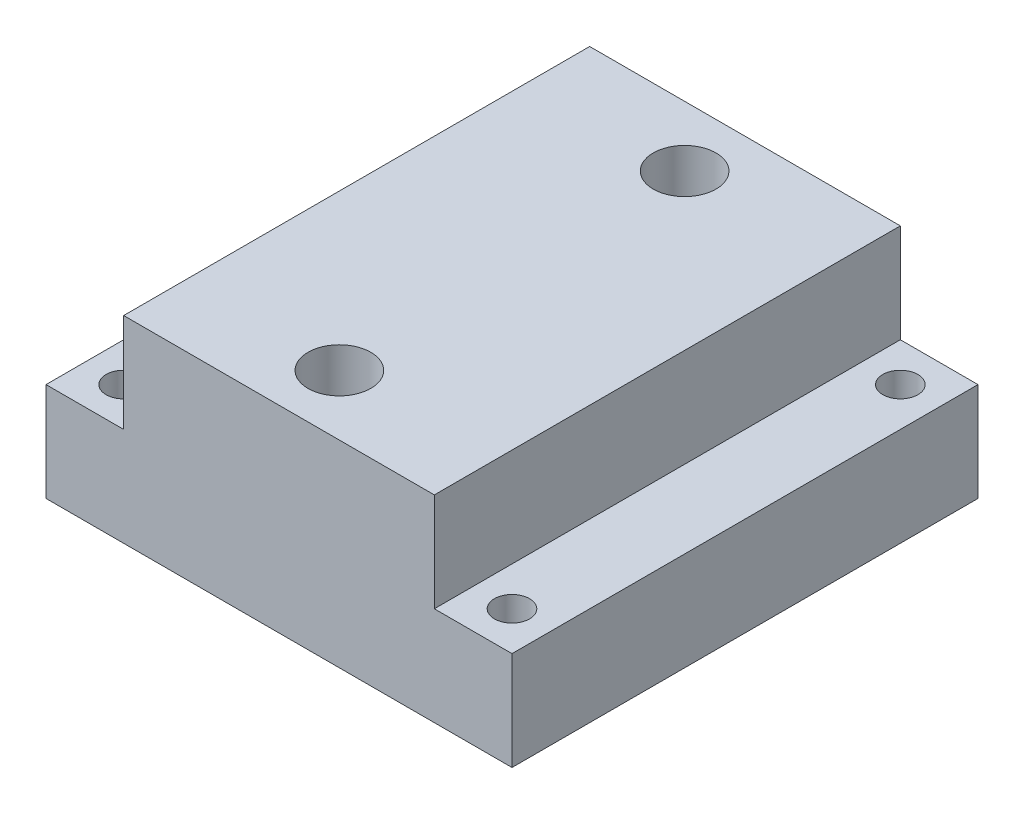
ISO-10303-21;
HEADER;
FILE_DESCRIPTION(('STEP AP214'),'2;1');
FILE_NAME('part.step','',(''),(''),'','','');
FILE_SCHEMA(('AUTOMOTIVE_DESIGN { 1 0 10303 214 1 1 1 1 }'));
ENDSEC;
DATA;
#1=APPLICATION_CONTEXT('core data for automotive mechanical design processes');
#2=APPLICATION_PROTOCOL_DEFINITION('international standard','automotive_design',2000,#1);
#3=PRODUCT_CONTEXT('',#1,'mechanical');
#4=PRODUCT('Part','Part','',(#3));
#5=PRODUCT_RELATED_PRODUCT_CATEGORY('part','',(#4));
#6=PRODUCT_DEFINITION_FORMATION('','',#4);
#7=PRODUCT_DEFINITION_CONTEXT('part definition',#1,'design');
#8=PRODUCT_DEFINITION('design','',#6,#7);
#9=PRODUCT_DEFINITION_SHAPE('','',#8);
#10=(LENGTH_UNIT() NAMED_UNIT(*) SI_UNIT(.MILLI.,.METRE.));
#11=(NAMED_UNIT(*) PLANE_ANGLE_UNIT() SI_UNIT($,.RADIAN.));
#12=(NAMED_UNIT(*) SI_UNIT($,.STERADIAN.) SOLID_ANGLE_UNIT());
#13=UNCERTAINTY_MEASURE_WITH_UNIT(LENGTH_MEASURE(1.E-05),#10,'distance_accuracy_value','');
#14=(GEOMETRIC_REPRESENTATION_CONTEXT(3) GLOBAL_UNCERTAINTY_ASSIGNED_CONTEXT((#13)) GLOBAL_UNIT_ASSIGNED_CONTEXT((#10,
#11,#12)) REPRESENTATION_CONTEXT('',''));
#15=CARTESIAN_POINT('',(0.,0.,0.));
#16=DIRECTION('',(0.,0.,1.));
#17=DIRECTION('',(1.,0.,0.));
#18=AXIS2_PLACEMENT_3D('',#15,#16,#17);
#19=CARTESIAN_POINT('',(0.,0.,30.));
#20=DIRECTION('',(1.,0.,0.));
#21=DIRECTION('',(0.,0.,-1.));
#22=AXIS2_PLACEMENT_3D('',#19,#20,#21);
#23=PLANE('',#22);
#24=DIRECTION('',(0.,0.,1.));
#25=VECTOR('',#24,1.);
#26=CARTESIAN_POINT('',(0.,6.35,30.));
#27=LINE('',#26,#25);
#28=CARTESIAN_POINT('',(0.,6.35,0.));
#29=VERTEX_POINT('',#28);
#30=CARTESIAN_POINT('',(0.,6.35,30.));
#31=VERTEX_POINT('',#30);
#32=EDGE_CURVE('E211',#29,#31,#27,.T.);
#33=ORIENTED_EDGE('',*,*,#32,.F.);
#34=DIRECTION('',(0.,-1.,0.));
#35=VECTOR('',#34,1.);
#36=CARTESIAN_POINT('',(0.,0.,0.));
#37=LINE('',#36,#35);
#38=CARTESIAN_POINT('',(0.,0.,0.));
#39=VERTEX_POINT('',#38);
#40=EDGE_CURVE('E172',#29,#39,#37,.T.);
#41=ORIENTED_EDGE('',*,*,#40,.T.);
#42=DIRECTION('',(0.,0.,-1.));
#43=VECTOR('',#42,1.);
#44=CARTESIAN_POINT('',(0.,0.,30.));
#45=LINE('',#44,#43);
#46=CARTESIAN_POINT('',(0.,0.,30.));
#47=VERTEX_POINT('',#46);
#48=EDGE_CURVE('E13',#47,#39,#45,.T.);
#49=ORIENTED_EDGE('',*,*,#48,.F.);
#50=DIRECTION('',(0.,-1.,0.));
#51=VECTOR('',#50,1.);
#52=CARTESIAN_POINT('',(0.,0.,30.));
#53=LINE('',#52,#51);
#54=EDGE_CURVE('E185',#31,#47,#53,.T.);
#55=ORIENTED_EDGE('',*,*,#54,.F.);
#56=EDGE_LOOP('',(#33,#41,#49,#55));
#57=FACE_BOUND('',#56,.T.);
#58=ADVANCED_FACE('F49',(#57),#23,.F.);
#59=CARTESIAN_POINT('',(30.,0.,30.));
#60=DIRECTION('',(-1.,0.,0.));
#61=DIRECTION('',(0.,0.,1.));
#62=AXIS2_PLACEMENT_3D('',#59,#60,#61);
#63=PLANE('',#62);
#64=DIRECTION('',(0.,0.,-1.));
#65=VECTOR('',#64,1.);
#66=CARTESIAN_POINT('',(30.,6.35,30.));
#67=LINE('',#66,#65);
#68=CARTESIAN_POINT('',(30.,6.35,30.));
#69=VERTEX_POINT('',#68);
#70=CARTESIAN_POINT('',(30.,6.35,0.));
#71=VERTEX_POINT('',#70);
#72=EDGE_CURVE('E77',#69,#71,#67,.T.);
#73=ORIENTED_EDGE('',*,*,#72,.F.);
#74=DIRECTION('',(0.,1.,0.));
#75=VECTOR('',#74,1.);
#76=CARTESIAN_POINT('',(30.,0.,30.));
#77=LINE('',#76,#75);
#78=CARTESIAN_POINT('',(30.,0.,30.));
#79=VERTEX_POINT('',#78);
#80=EDGE_CURVE('E160',#79,#69,#77,.T.);
#81=ORIENTED_EDGE('',*,*,#80,.F.);
#82=DIRECTION('',(0.,0.,-1.));
#83=VECTOR('',#82,1.);
#84=CARTESIAN_POINT('',(30.,0.,30.));
#85=LINE('',#84,#83);
#86=CARTESIAN_POINT('',(30.,0.,0.));
#87=VERTEX_POINT('',#86);
#88=EDGE_CURVE('E58',#79,#87,#85,.T.);
#89=ORIENTED_EDGE('',*,*,#88,.T.);
#90=DIRECTION('',(0.,1.,0.));
#91=VECTOR('',#90,1.);
#92=CARTESIAN_POINT('',(30.,0.,0.));
#93=LINE('',#92,#91);
#94=EDGE_CURVE('E179',#87,#71,#93,.T.);
#95=ORIENTED_EDGE('',*,*,#94,.T.);
#96=EDGE_LOOP('',(#73,#81,#89,#95));
#97=FACE_BOUND('',#96,.T.);
#98=ADVANCED_FACE('F265',(#97),#63,.F.);
#99=CARTESIAN_POINT('',(0.,12.7,30.));
#100=DIRECTION('',(0.,-1.,0.));
#101=DIRECTION('',(0.,0.,-1.));
#102=AXIS2_PLACEMENT_3D('',#99,#100,#101);
#103=PLANE('',#102);
#104=CARTESIAN_POINT('',(15.,12.7,3.8875));
#105=DIRECTION('',(0.,1.,0.));
#106=DIRECTION('',(0.,0.,1.));
#107=AXIS2_PLACEMENT_3D('',#104,#105,#106);
#108=CIRCLE('',#107,2.01929999999999);
#109=CARTESIAN_POINT('',(15.,12.7,5.90679999999999));
#110=VERTEX_POINT('',#109);
#111=EDGE_CURVE('E256',#110,#110,#108,.T.);
#112=ORIENTED_EDGE('',*,*,#111,.F.);
#113=EDGE_LOOP('',(#112));
#114=FACE_BOUND('',#113,.T.);
#115=CARTESIAN_POINT('',(15.,12.7,26.1125));
#116=DIRECTION('',(0.,1.,0.));
#117=DIRECTION('',(0.,0.,1.));
#118=AXIS2_PLACEMENT_3D('',#115,#116,#117);
#119=CIRCLE('',#118,2.01929999999999);
#120=CARTESIAN_POINT('',(15.,12.7,28.1318));
#121=VERTEX_POINT('',#120);
#122=EDGE_CURVE('E249',#121,#121,#119,.T.);
#123=ORIENTED_EDGE('',*,*,#122,.F.);
#124=EDGE_LOOP('',(#123));
#125=FACE_BOUND('',#124,.T.);
#126=DIRECTION('',(0.,0.,-1.));
#127=VECTOR('',#126,1.);
#128=CARTESIAN_POINT('',(25.,12.7,0.));
#129=LINE('',#128,#127);
#130=CARTESIAN_POINT('',(25.,12.7,30.));
#131=VERTEX_POINT('',#130);
#132=CARTESIAN_POINT('',(25.,12.7,0.));
#133=VERTEX_POINT('',#132);
#134=EDGE_CURVE('E131',#131,#133,#129,.T.);
#135=ORIENTED_EDGE('',*,*,#134,.T.);
#136=DIRECTION('',(-1.,0.,0.));
#137=VECTOR('',#136,1.);
#138=CARTESIAN_POINT('',(0.,12.7,0.));
#139=LINE('',#138,#137);
#140=CARTESIAN_POINT('',(5.,12.7,0.));
#141=VERTEX_POINT('',#140);
#142=EDGE_CURVE('E183',#133,#141,#139,.T.);
#143=ORIENTED_EDGE('',*,*,#142,.T.);
#144=DIRECTION('',(0.,0.,1.));
#145=VECTOR('',#144,1.);
#146=CARTESIAN_POINT('',(5.,12.7,0.));
#147=LINE('',#146,#145);
#148=CARTESIAN_POINT('',(4.99999999999999,12.7,30.));
#149=VERTEX_POINT('',#148);
#150=EDGE_CURVE('E145',#141,#149,#147,.T.);
#151=ORIENTED_EDGE('',*,*,#150,.T.);
#152=DIRECTION('',(-1.,0.,0.));
#153=VECTOR('',#152,1.);
#154=CARTESIAN_POINT('',(0.,12.7,30.));
#155=LINE('',#154,#153);
#156=EDGE_CURVE('E152',#131,#149,#155,.T.);
#157=ORIENTED_EDGE('',*,*,#156,.F.);
#158=EDGE_LOOP('',(#135,#143,#151,#157));
#159=FACE_BOUND('',#158,.T.);
#160=ADVANCED_FACE('F158',(#114,#125,#159),#103,.F.);
#161=CARTESIAN_POINT('',(0.,0.,30.));
#162=DIRECTION('',(0.,0.,-1.));
#163=DIRECTION('',(-1.,0.,0.));
#164=AXIS2_PLACEMENT_3D('',#161,#162,#163);
#165=PLANE('',#164);
#166=DIRECTION('',(1.,0.,0.));
#167=VECTOR('',#166,1.);
#168=CARTESIAN_POINT('',(0.,6.35,30.));
#169=LINE('',#168,#167);
#170=CARTESIAN_POINT('',(4.99999999999999,6.35,30.));
#171=VERTEX_POINT('',#170);
#172=EDGE_CURVE('E210',#31,#171,#169,.T.);
#173=ORIENTED_EDGE('',*,*,#172,.F.);
#174=ORIENTED_EDGE('',*,*,#54,.T.);
#175=DIRECTION('',(1.,0.,0.));
#176=VECTOR('',#175,1.);
#177=CARTESIAN_POINT('',(0.,0.,30.));
#178=LINE('',#177,#176);
#179=EDGE_CURVE('E168',#47,#79,#178,.T.);
#180=ORIENTED_EDGE('',*,*,#179,.T.);
#181=ORIENTED_EDGE('',*,*,#80,.T.);
#182=CARTESIAN_POINT('',(25.,6.35,30.));
#183=VERTEX_POINT('',#182);
#184=EDGE_CURVE('E154',#183,#69,#169,.T.);
#185=ORIENTED_EDGE('',*,*,#184,.F.);
#186=DIRECTION('',(0.,1.,0.));
#187=VECTOR('',#186,1.);
#188=CARTESIAN_POINT('',(25.,-44.3465934268522,30.));
#189=LINE('',#188,#187);
#190=EDGE_CURVE('E135',#183,#131,#189,.T.);
#191=ORIENTED_EDGE('',*,*,#190,.T.);
#192=ORIENTED_EDGE('',*,*,#156,.T.);
#193=DIRECTION('',(0.,1.,0.));
#194=VECTOR('',#193,1.);
#195=CARTESIAN_POINT('',(4.99999999999999,-44.3465934268522,30.));
#196=LINE('',#195,#194);
#197=EDGE_CURVE('E144',#171,#149,#196,.T.);
#198=ORIENTED_EDGE('',*,*,#197,.F.);
#199=EDGE_LOOP('',(#173,#174,#180,#181,#185,#191,#192,#198));
#200=FACE_BOUND('',#199,.T.);
#201=ADVANCED_FACE('F150',(#200),#165,.F.);
#202=CARTESIAN_POINT('',(0.,0.,0.));
#203=DIRECTION('',(0.,0.,-1.));
#204=DIRECTION('',(-1.,0.,0.));
#205=AXIS2_PLACEMENT_3D('',#202,#203,#204);
#206=PLANE('',#205);
#207=ORIENTED_EDGE('',*,*,#40,.F.);
#208=DIRECTION('',(1.,0.,0.));
#209=VECTOR('',#208,1.);
#210=CARTESIAN_POINT('',(0.,6.35,0.));
#211=LINE('',#210,#209);
#212=CARTESIAN_POINT('',(5.,6.35,0.));
#213=VERTEX_POINT('',#212);
#214=EDGE_CURVE('E213',#29,#213,#211,.T.);
#215=ORIENTED_EDGE('',*,*,#214,.T.);
#216=DIRECTION('',(0.,1.,0.));
#217=VECTOR('',#216,1.);
#218=CARTESIAN_POINT('',(5.,-44.3465934268522,0.));
#219=LINE('',#218,#217);
#220=EDGE_CURVE('E235',#213,#141,#219,.T.);
#221=ORIENTED_EDGE('',*,*,#220,.T.);
#222=ORIENTED_EDGE('',*,*,#142,.F.);
#223=DIRECTION('',(0.,1.,0.));
#224=VECTOR('',#223,1.);
#225=CARTESIAN_POINT('',(25.,-44.3465934268522,0.));
#226=LINE('',#225,#224);
#227=CARTESIAN_POINT('',(25.,6.35,0.));
#228=VERTEX_POINT('',#227);
#229=EDGE_CURVE('E138',#228,#133,#226,.T.);
#230=ORIENTED_EDGE('',*,*,#229,.F.);
#231=EDGE_CURVE('E218',#228,#71,#211,.T.);
#232=ORIENTED_EDGE('',*,*,#231,.T.);
#233=ORIENTED_EDGE('',*,*,#94,.F.);
#234=DIRECTION('',(1.,0.,0.));
#235=VECTOR('',#234,1.);
#236=CARTESIAN_POINT('',(0.,0.,0.));
#237=LINE('',#236,#235);
#238=EDGE_CURVE('E175',#39,#87,#237,.T.);
#239=ORIENTED_EDGE('',*,*,#238,.F.);
#240=EDGE_LOOP('',(#207,#215,#221,#222,#230,#232,#233,#239));
#241=FACE_BOUND('',#240,.T.);
#242=ADVANCED_FACE('F296',(#241),#206,.T.);
#243=CARTESIAN_POINT('',(2.5,12.7,27.5));
#244=DIRECTION('',(0.,1.,0.));
#245=DIRECTION('',(0.,0.,1.));
#246=AXIS2_PLACEMENT_3D('',#243,#244,#245);
#247=CYLINDRICAL_SURFACE('',#246,1.13029999999999);
#248=CARTESIAN_POINT('',(2.5,0.,27.5));
#249=DIRECTION('',(0.,1.,0.));
#250=DIRECTION('',(0.,0.,1.));
#251=AXIS2_PLACEMENT_3D('',#248,#249,#250);
#252=CIRCLE('',#251,1.1303);
#253=CARTESIAN_POINT('',(2.5,0.,28.6303));
#254=VERTEX_POINT('',#253);
#255=EDGE_CURVE('E176',#254,#254,#252,.T.);
#256=ORIENTED_EDGE('',*,*,#255,.F.);
#257=EDGE_LOOP('',(#256));
#258=FACE_BOUND('',#257,.T.);
#259=CARTESIAN_POINT('',(2.5,6.35,27.5));
#260=DIRECTION('',(0.,1.,0.));
#261=DIRECTION('',(0.,0.,1.));
#262=AXIS2_PLACEMENT_3D('',#259,#260,#261);
#263=CIRCLE('',#262,1.13029999999999);
#264=CARTESIAN_POINT('',(2.5,6.35,28.6303));
#265=VERTEX_POINT('',#264);
#266=EDGE_CURVE('E221',#265,#265,#263,.F.);
#267=ORIENTED_EDGE('',*,*,#266,.F.);
#268=EDGE_LOOP('',(#267));
#269=FACE_BOUND('',#268,.T.);
#270=ADVANCED_FACE('F319',(#258,#269),#247,.F.);
#271=CARTESIAN_POINT('',(27.5,12.7,27.5));
#272=DIRECTION('',(0.,1.,0.));
#273=DIRECTION('',(0.,0.,1.));
#274=AXIS2_PLACEMENT_3D('',#271,#272,#273);
#275=CYLINDRICAL_SURFACE('',#274,1.13029999999999);
#276=CARTESIAN_POINT('',(27.5,0.,27.5));
#277=DIRECTION('',(0.,1.,0.));
#278=DIRECTION('',(0.,0.,1.));
#279=AXIS2_PLACEMENT_3D('',#276,#277,#278);
#280=CIRCLE('',#279,1.1303);
#281=CARTESIAN_POINT('',(27.5,0.,28.6303));
#282=VERTEX_POINT('',#281);
#283=EDGE_CURVE('E198',#282,#282,#280,.T.);
#284=ORIENTED_EDGE('',*,*,#283,.F.);
#285=EDGE_LOOP('',(#284));
#286=FACE_BOUND('',#285,.T.);
#287=CARTESIAN_POINT('',(27.5,6.35,27.5));
#288=DIRECTION('',(0.,1.,0.));
#289=DIRECTION('',(0.,0.,1.));
#290=AXIS2_PLACEMENT_3D('',#287,#288,#289);
#291=CIRCLE('',#290,1.13029999999999);
#292=CARTESIAN_POINT('',(27.5,6.35,28.6303));
#293=VERTEX_POINT('',#292);
#294=EDGE_CURVE('E225',#293,#293,#291,.F.);
#295=ORIENTED_EDGE('',*,*,#294,.F.);
#296=EDGE_LOOP('',(#295));
#297=FACE_BOUND('',#296,.T.);
#298=ADVANCED_FACE('F324',(#286,#297),#275,.F.);
#299=CARTESIAN_POINT('',(27.5,12.7,2.5));
#300=DIRECTION('',(0.,1.,0.));
#301=DIRECTION('',(0.,0.,1.));
#302=AXIS2_PLACEMENT_3D('',#299,#300,#301);
#303=CYLINDRICAL_SURFACE('',#302,1.13029999999999);
#304=CARTESIAN_POINT('',(27.5,0.,2.5));
#305=DIRECTION('',(0.,1.,0.));
#306=DIRECTION('',(0.,0.,1.));
#307=AXIS2_PLACEMENT_3D('',#304,#305,#306);
#308=CIRCLE('',#307,1.1303);
#309=CARTESIAN_POINT('',(27.5,0.,3.63029999999999));
#310=VERTEX_POINT('',#309);
#311=EDGE_CURVE('E202',#310,#310,#308,.T.);
#312=ORIENTED_EDGE('',*,*,#311,.F.);
#313=EDGE_LOOP('',(#312));
#314=FACE_BOUND('',#313,.T.);
#315=CARTESIAN_POINT('',(27.5,6.35,2.5));
#316=DIRECTION('',(0.,1.,0.));
#317=DIRECTION('',(0.,0.,1.));
#318=AXIS2_PLACEMENT_3D('',#315,#316,#317);
#319=CIRCLE('',#318,1.13029999999999);
#320=CARTESIAN_POINT('',(27.5,6.35,3.63029999999999));
#321=VERTEX_POINT('',#320);
#322=EDGE_CURVE('E229',#321,#321,#319,.F.);
#323=ORIENTED_EDGE('',*,*,#322,.F.);
#324=EDGE_LOOP('',(#323));
#325=FACE_BOUND('',#324,.T.);
#326=ADVANCED_FACE('F312',(#314,#325),#303,.F.);
#327=CARTESIAN_POINT('',(2.5,12.7,2.5));
#328=DIRECTION('',(0.,1.,0.));
#329=DIRECTION('',(0.,0.,1.));
#330=AXIS2_PLACEMENT_3D('',#327,#328,#329);
#331=CYLINDRICAL_SURFACE('',#330,1.13029999999999);
#332=CARTESIAN_POINT('',(2.5,0.,2.5));
#333=DIRECTION('',(0.,1.,0.));
#334=DIRECTION('',(0.,0.,1.));
#335=AXIS2_PLACEMENT_3D('',#332,#333,#334);
#336=CIRCLE('',#335,1.1303);
#337=CARTESIAN_POINT('',(2.5,0.,3.6303));
#338=VERTEX_POINT('',#337);
#339=EDGE_CURVE('E206',#338,#338,#336,.T.);
#340=ORIENTED_EDGE('',*,*,#339,.F.);
#341=EDGE_LOOP('',(#340));
#342=FACE_BOUND('',#341,.T.);
#343=CARTESIAN_POINT('',(2.5,6.35,2.5));
#344=DIRECTION('',(0.,1.,0.));
#345=DIRECTION('',(0.,0.,1.));
#346=AXIS2_PLACEMENT_3D('',#343,#344,#345);
#347=CIRCLE('',#346,1.13029999999999);
#348=CARTESIAN_POINT('',(2.5,6.35,3.63029999999999));
#349=VERTEX_POINT('',#348);
#350=EDGE_CURVE('E52',#349,#349,#347,.F.);
#351=ORIENTED_EDGE('',*,*,#350,.F.);
#352=EDGE_LOOP('',(#351));
#353=FACE_BOUND('',#352,.T.);
#354=ADVANCED_FACE('F304',(#342,#353),#331,.F.);
#355=CARTESIAN_POINT('',(0.,0.,30.));
#356=DIRECTION('',(0.,1.,0.));
#357=DIRECTION('',(0.,0.,1.));
#358=AXIS2_PLACEMENT_3D('',#355,#356,#357);
#359=PLANE('',#358);
#360=CARTESIAN_POINT('',(15.,0.,3.8875));
#361=DIRECTION('',(0.,1.,0.));
#362=DIRECTION('',(0.,0.,1.));
#363=AXIS2_PLACEMENT_3D('',#360,#361,#362);
#364=CIRCLE('',#363,2.01929999999999);
#365=CARTESIAN_POINT('',(15.,0.,5.9068));
#366=VERTEX_POINT('',#365);
#367=EDGE_CURVE('E252',#366,#366,#364,.T.);
#368=ORIENTED_EDGE('',*,*,#367,.T.);
#369=EDGE_LOOP('',(#368));
#370=FACE_BOUND('',#369,.T.);
#371=CARTESIAN_POINT('',(15.,0.,26.1125));
#372=DIRECTION('',(0.,1.,0.));
#373=DIRECTION('',(0.,0.,1.));
#374=AXIS2_PLACEMENT_3D('',#371,#372,#373);
#375=CIRCLE('',#374,2.01929999999999);
#376=CARTESIAN_POINT('',(15.,0.,28.1318));
#377=VERTEX_POINT('',#376);
#378=EDGE_CURVE('E240',#377,#377,#375,.T.);
#379=ORIENTED_EDGE('',*,*,#378,.T.);
#380=EDGE_LOOP('',(#379));
#381=FACE_BOUND('',#380,.T.);
#382=ORIENTED_EDGE('',*,*,#339,.T.);
#383=EDGE_LOOP('',(#382));
#384=FACE_BOUND('',#383,.T.);
#385=ORIENTED_EDGE('',*,*,#311,.T.);
#386=EDGE_LOOP('',(#385));
#387=FACE_BOUND('',#386,.T.);
#388=ORIENTED_EDGE('',*,*,#283,.T.);
#389=EDGE_LOOP('',(#388));
#390=FACE_BOUND('',#389,.T.);
#391=ORIENTED_EDGE('',*,*,#255,.T.);
#392=EDGE_LOOP('',(#391));
#393=FACE_BOUND('',#392,.T.);
#394=ORIENTED_EDGE('',*,*,#238,.T.);
#395=ORIENTED_EDGE('',*,*,#88,.F.);
#396=ORIENTED_EDGE('',*,*,#179,.F.);
#397=ORIENTED_EDGE('',*,*,#48,.T.);
#398=EDGE_LOOP('',(#394,#395,#396,#397));
#399=FACE_BOUND('',#398,.T.);
#400=ADVANCED_FACE('F300',(#370,#381,#384,#387,#390,#393,#399),#359,.F.);
#401=CARTESIAN_POINT('',(0.,6.35,30.));
#402=DIRECTION('',(0.,1.,0.));
#403=DIRECTION('',(0.,0.,1.));
#404=AXIS2_PLACEMENT_3D('',#401,#402,#403);
#405=PLANE('',#404);
#406=ORIENTED_EDGE('',*,*,#266,.T.);
#407=EDGE_LOOP('',(#406));
#408=FACE_BOUND('',#407,.T.);
#409=ORIENTED_EDGE('',*,*,#350,.T.);
#410=EDGE_LOOP('',(#409));
#411=FACE_BOUND('',#410,.T.);
#412=ORIENTED_EDGE('',*,*,#172,.T.);
#413=DIRECTION('',(0.,0.,-1.));
#414=VECTOR('',#413,1.);
#415=CARTESIAN_POINT('',(5.,6.35,0.));
#416=LINE('',#415,#414);
#417=EDGE_CURVE('E67',#171,#213,#416,.T.);
#418=ORIENTED_EDGE('',*,*,#417,.T.);
#419=ORIENTED_EDGE('',*,*,#214,.F.);
#420=ORIENTED_EDGE('',*,*,#32,.T.);
#421=EDGE_LOOP('',(#412,#418,#419,#420));
#422=FACE_BOUND('',#421,.T.);
#423=ADVANCED_FACE('F303',(#408,#411,#422),#405,.T.);
#424=CARTESIAN_POINT('',(5.,-44.3465934268522,0.));
#425=DIRECTION('',(-1.,0.,0.));
#426=DIRECTION('',(0.,0.,1.));
#427=AXIS2_PLACEMENT_3D('',#424,#425,#426);
#428=PLANE('',#427);
#429=ORIENTED_EDGE('',*,*,#197,.T.);
#430=ORIENTED_EDGE('',*,*,#150,.F.);
#431=ORIENTED_EDGE('',*,*,#220,.F.);
#432=ORIENTED_EDGE('',*,*,#417,.F.);
#433=EDGE_LOOP('',(#429,#430,#431,#432));
#434=FACE_BOUND('',#433,.T.);
#435=ADVANCED_FACE('F310',(#434),#428,.T.);
#436=ORIENTED_EDGE('',*,*,#322,.T.);
#437=EDGE_LOOP('',(#436));
#438=FACE_BOUND('',#437,.T.);
#439=ORIENTED_EDGE('',*,*,#294,.T.);
#440=EDGE_LOOP('',(#439));
#441=FACE_BOUND('',#440,.T.);
#442=ORIENTED_EDGE('',*,*,#184,.T.);
#443=ORIENTED_EDGE('',*,*,#72,.T.);
#444=ORIENTED_EDGE('',*,*,#231,.F.);
#445=DIRECTION('',(0.,0.,1.));
#446=VECTOR('',#445,1.);
#447=CARTESIAN_POINT('',(25.,6.35,0.));
#448=LINE('',#447,#446);
#449=EDGE_CURVE('E243',#228,#183,#448,.T.);
#450=ORIENTED_EDGE('',*,*,#449,.T.);
#451=EDGE_LOOP('',(#442,#443,#444,#450));
#452=FACE_BOUND('',#451,.T.);
#453=ADVANCED_FACE('F279',(#438,#441,#452),#405,.T.);
#454=CARTESIAN_POINT('',(25.,-44.3465934268522,0.));
#455=DIRECTION('',(1.,0.,0.));
#456=DIRECTION('',(0.,0.,-1.));
#457=AXIS2_PLACEMENT_3D('',#454,#455,#456);
#458=PLANE('',#457);
#459=ORIENTED_EDGE('',*,*,#229,.T.);
#460=ORIENTED_EDGE('',*,*,#134,.F.);
#461=ORIENTED_EDGE('',*,*,#190,.F.);
#462=ORIENTED_EDGE('',*,*,#449,.F.);
#463=EDGE_LOOP('',(#459,#460,#461,#462));
#464=FACE_BOUND('',#463,.T.);
#465=ADVANCED_FACE('F133',(#464),#458,.T.);
#466=CARTESIAN_POINT('',(15.,12.7,26.1125));
#467=DIRECTION('',(0.,1.,0.));
#468=DIRECTION('',(0.,0.,1.));
#469=AXIS2_PLACEMENT_3D('',#466,#467,#468);
#470=CYLINDRICAL_SURFACE('',#469,2.01929999999999);
#471=ORIENTED_EDGE('',*,*,#378,.F.);
#472=EDGE_LOOP('',(#471));
#473=FACE_BOUND('',#472,.T.);
#474=ORIENTED_EDGE('',*,*,#122,.T.);
#475=EDGE_LOOP('',(#474));
#476=FACE_BOUND('',#475,.T.);
#477=ADVANCED_FACE('F269',(#473,#476),#470,.F.);
#478=CARTESIAN_POINT('',(15.,12.7,3.8875));
#479=DIRECTION('',(0.,1.,0.));
#480=DIRECTION('',(0.,0.,1.));
#481=AXIS2_PLACEMENT_3D('',#478,#479,#480);
#482=CYLINDRICAL_SURFACE('',#481,2.01929999999999);
#483=ORIENTED_EDGE('',*,*,#367,.F.);
#484=EDGE_LOOP('',(#483));
#485=FACE_BOUND('',#484,.T.);
#486=ORIENTED_EDGE('',*,*,#111,.T.);
#487=EDGE_LOOP('',(#486));
#488=FACE_BOUND('',#487,.T.);
#489=ADVANCED_FACE('F261',(#485,#488),#482,.F.);
#490=CLOSED_SHELL('',(#58,#98,#160,#201,#242,#270,#298,#326,#354,#400,#423,#435,#453,#465,#477,#489));
#491=MANIFOLD_SOLID_BREP('B2',#490);
#492=ADVANCED_BREP_SHAPE_REPRESENTATION('',(#18,#491),#14);
#493=SHAPE_DEFINITION_REPRESENTATION(#9,#492);
ENDSEC;
END-ISO-10303-21;
